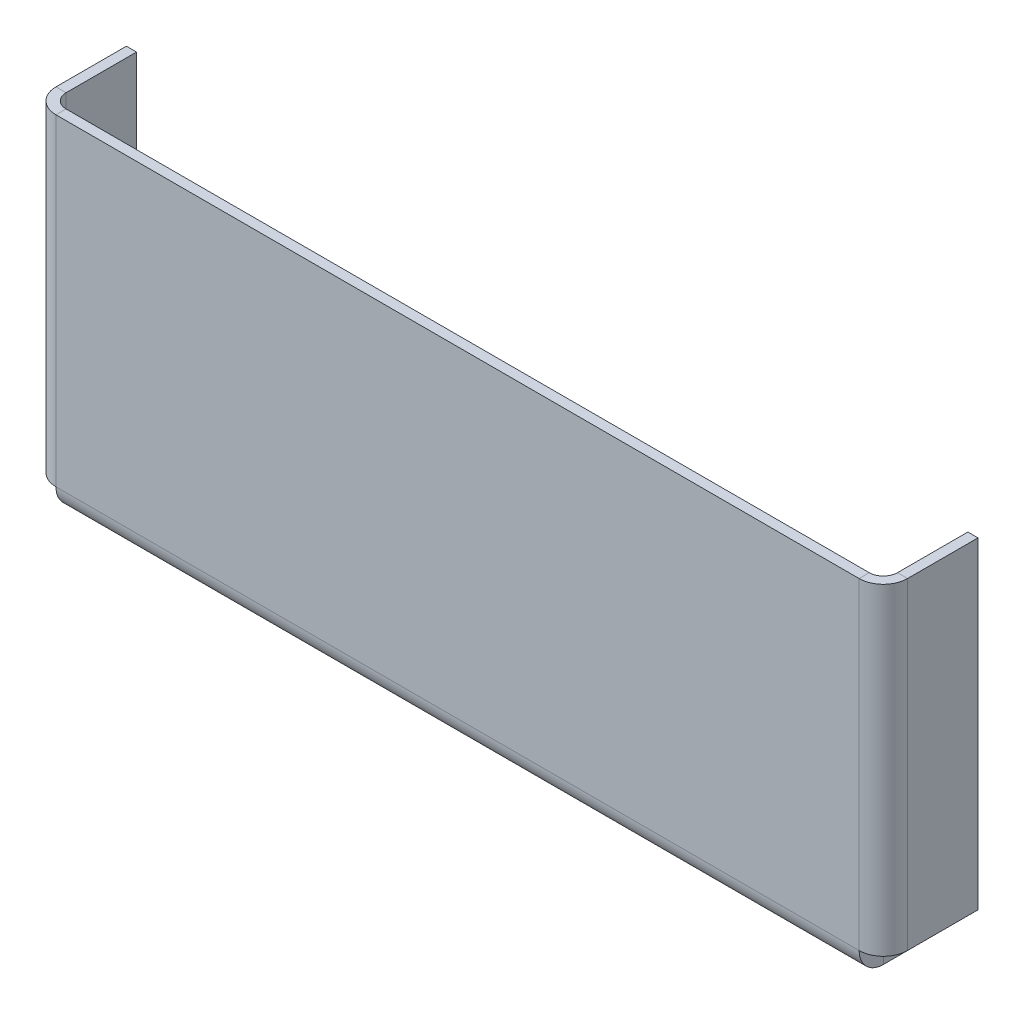
ISO-10303-21;
HEADER;
FILE_DESCRIPTION(('STEP AP214'),'2;1');
FILE_NAME('part.step','',(''),(''),'','','');
FILE_SCHEMA(('AUTOMOTIVE_DESIGN { 1 0 10303 214 1 1 1 1 }'));
ENDSEC;
DATA;
#1=APPLICATION_CONTEXT('core data for automotive mechanical design processes');
#2=APPLICATION_PROTOCOL_DEFINITION('international standard','automotive_design',2000,#1);
#3=PRODUCT_CONTEXT('',#1,'mechanical');
#4=PRODUCT('Part','Part','',(#3));
#5=PRODUCT_RELATED_PRODUCT_CATEGORY('part','',(#4));
#6=PRODUCT_DEFINITION_FORMATION('','',#4);
#7=PRODUCT_DEFINITION_CONTEXT('part definition',#1,'design');
#8=PRODUCT_DEFINITION('design','',#6,#7);
#9=PRODUCT_DEFINITION_SHAPE('','',#8);
#10=(LENGTH_UNIT() NAMED_UNIT(*) SI_UNIT(.MILLI.,.METRE.));
#11=(NAMED_UNIT(*) PLANE_ANGLE_UNIT() SI_UNIT($,.RADIAN.));
#12=(NAMED_UNIT(*) SI_UNIT($,.STERADIAN.) SOLID_ANGLE_UNIT());
#13=UNCERTAINTY_MEASURE_WITH_UNIT(LENGTH_MEASURE(1.E-05),#10,'distance_accuracy_value','');
#14=(GEOMETRIC_REPRESENTATION_CONTEXT(3) GLOBAL_UNCERTAINTY_ASSIGNED_CONTEXT((#13)) GLOBAL_UNIT_ASSIGNED_CONTEXT((#10,
#11,#12)) REPRESENTATION_CONTEXT('',''));
#15=CARTESIAN_POINT('',(0.,0.,0.));
#16=DIRECTION('',(0.,0.,1.));
#17=DIRECTION('',(1.,0.,0.));
#18=AXIS2_PLACEMENT_3D('',#15,#16,#17);
#19=CARTESIAN_POINT('',(0.,30.3089154956949,-29.5681400000001));
#20=DIRECTION('',(0.,0.,1.));
#21=DIRECTION('',(0.,-1.,0.));
#22=AXIS2_PLACEMENT_3D('',#19,#20,#21);
#23=PLANE('',#22);
#24=DIRECTION('',(0.,1.,0.));
#25=VECTOR('',#24,1.);
#26=CARTESIAN_POINT('',(0.,30.3089154956949,-29.5681400000001));
#27=LINE('',#26,#25);
#28=CARTESIAN_POINT('',(0.,1.27000000000001,-29.56814));
#29=VERTEX_POINT('',#28);
#30=CARTESIAN_POINT('',(0.,30.3089154956949,-29.5681400000001));
#31=VERTEX_POINT('',#30);
#32=EDGE_CURVE('E85',#29,#31,#27,.T.);
#33=ORIENTED_EDGE('',*,*,#32,.F.);
#34=DIRECTION('',(1.,0.,0.));
#35=VECTOR('',#34,1.);
#36=CARTESIAN_POINT('',(0.,1.27000000000001,-29.56814));
#37=LINE('',#36,#35);
#38=CARTESIAN_POINT('',(72.39,1.27000000000001,-29.56814));
#39=VERTEX_POINT('',#38);
#40=EDGE_CURVE('E311',#29,#39,#37,.T.);
#41=ORIENTED_EDGE('',*,*,#40,.T.);
#42=DIRECTION('',(0.,-1.,0.));
#43=VECTOR('',#42,1.);
#44=CARTESIAN_POINT('',(72.39,30.3089154956948,-29.5681400000001));
#45=LINE('',#44,#43);
#46=CARTESIAN_POINT('',(72.39,30.3089154956948,-29.5681400000001));
#47=VERTEX_POINT('',#46);
#48=EDGE_CURVE('E99',#47,#39,#45,.T.);
#49=ORIENTED_EDGE('',*,*,#48,.F.);
#50=DIRECTION('',(1.,0.,0.));
#51=VECTOR('',#50,1.);
#52=CARTESIAN_POINT('',(0.,30.3089154956949,-29.5681400000001));
#53=LINE('',#52,#51);
#54=EDGE_CURVE('E183',#31,#47,#53,.T.);
#55=ORIENTED_EDGE('',*,*,#54,.F.);
#56=EDGE_LOOP('',(#33,#41,#49,#55));
#57=FACE_BOUND('',#56,.T.);
#58=ADVANCED_FACE('F81',(#57),#23,.T.);
#59=CARTESIAN_POINT('',(0.,30.3089154956949,-29.5681400000001));
#60=DIRECTION('',(0.,1.,0.));
#61=DIRECTION('',(1.,0.,0.));
#62=AXIS2_PLACEMENT_3D('',#59,#60,#61);
#63=PLANE('',#62);
#64=DIRECTION('',(1.,0.,0.));
#65=VECTOR('',#64,1.);
#66=CARTESIAN_POINT('',(0.,30.3089154956948,-30.4800000000001));
#67=LINE('',#66,#65);
#68=CARTESIAN_POINT('',(0.,30.3089154956948,-30.4800000000001));
#69=VERTEX_POINT('',#68);
#70=CARTESIAN_POINT('',(72.39,30.3089154956948,-30.4800000000001));
#71=VERTEX_POINT('',#70);
#72=EDGE_CURVE('E306',#69,#71,#67,.T.);
#73=ORIENTED_EDGE('',*,*,#72,.F.);
#74=DIRECTION('',(0.,0.,-1.));
#75=VECTOR('',#74,1.);
#76=CARTESIAN_POINT('',(0.,30.3089154956949,-29.5681400000001));
#77=LINE('',#76,#75);
#78=EDGE_CURVE('E219',#31,#69,#77,.T.);
#79=ORIENTED_EDGE('',*,*,#78,.F.);
#80=ORIENTED_EDGE('',*,*,#54,.T.);
#81=DIRECTION('',(0.,0.,-1.));
#82=VECTOR('',#81,1.);
#83=CARTESIAN_POINT('',(72.39,30.3089154956948,-29.5681400000001));
#84=LINE('',#83,#82);
#85=EDGE_CURVE('E309',#47,#71,#84,.T.);
#86=ORIENTED_EDGE('',*,*,#85,.T.);
#87=EDGE_LOOP('',(#73,#79,#80,#86));
#88=FACE_BOUND('',#87,.T.);
#89=ADVANCED_FACE('F454',(#88),#63,.T.);
#90=CARTESIAN_POINT('',(0.,30.3089154956948,-30.4800000000001));
#91=DIRECTION('',(0.,0.,1.));
#92=DIRECTION('',(0.,-1.,0.));
#93=AXIS2_PLACEMENT_3D('',#90,#91,#92);
#94=PLANE('',#93);
#95=DIRECTION('',(1.,0.,0.));
#96=VECTOR('',#95,1.);
#97=CARTESIAN_POINT('',(0.,1.27,-30.48));
#98=LINE('',#97,#96);
#99=CARTESIAN_POINT('',(0.,1.27,-30.48));
#100=VERTEX_POINT('',#99);
#101=CARTESIAN_POINT('',(72.39,1.27,-30.48));
#102=VERTEX_POINT('',#101);
#103=EDGE_CURVE('E91',#100,#102,#98,.T.);
#104=ORIENTED_EDGE('',*,*,#103,.F.);
#105=DIRECTION('',(0.,1.,0.));
#106=VECTOR('',#105,1.);
#107=CARTESIAN_POINT('',(0.,30.3089154956948,-30.4800000000001));
#108=LINE('',#107,#106);
#109=EDGE_CURVE('E112',#100,#69,#108,.T.);
#110=ORIENTED_EDGE('',*,*,#109,.T.);
#111=ORIENTED_EDGE('',*,*,#72,.T.);
#112=DIRECTION('',(0.,-1.,0.));
#113=VECTOR('',#112,1.);
#114=CARTESIAN_POINT('',(72.39,30.3089154956948,-30.4800000000001));
#115=LINE('',#114,#113);
#116=EDGE_CURVE('E308',#71,#102,#115,.T.);
#117=ORIENTED_EDGE('',*,*,#116,.T.);
#118=EDGE_LOOP('',(#104,#110,#111,#117));
#119=FACE_BOUND('',#118,.T.);
#120=ADVANCED_FACE('F83',(#119),#94,.F.);
#121=CARTESIAN_POINT('',(49.53,-0.91186,-50.8));
#122=DIRECTION('',(0.485642931178632,0.,-0.874157276121538));
#123=DIRECTION('',(-0.874157276121538,0.,-0.485642931178632));
#124=AXIS2_PLACEMENT_3D('',#121,#122,#123);
#125=PLANE('',#124);
#126=DIRECTION('',(-0.874157276121538,0.,-0.485642931178632));
#127=VECTOR('',#126,1.);
#128=CARTESIAN_POINT('',(49.53,0.,-50.8));
#129=LINE('',#128,#127);
#130=CARTESIAN_POINT('',(72.39,0.,-38.1));
#131=VERTEX_POINT('',#130);
#132=CARTESIAN_POINT('',(49.53,0.,-50.8));
#133=VERTEX_POINT('',#132);
#134=EDGE_CURVE('E273',#131,#133,#129,.T.);
#135=ORIENTED_EDGE('',*,*,#134,.F.);
#136=DIRECTION('',(0.,1.,0.));
#137=VECTOR('',#136,1.);
#138=CARTESIAN_POINT('',(72.39,-0.91186,-38.1));
#139=LINE('',#138,#137);
#140=CARTESIAN_POINT('',(72.39,-0.91186,-38.1));
#141=VERTEX_POINT('',#140);
#142=EDGE_CURVE('E264',#141,#131,#139,.T.);
#143=ORIENTED_EDGE('',*,*,#142,.F.);
#144=DIRECTION('',(-0.874157276121538,0.,-0.485642931178632));
#145=VECTOR('',#144,1.);
#146=CARTESIAN_POINT('',(49.53,-0.91186,-50.8));
#147=LINE('',#146,#145);
#148=CARTESIAN_POINT('',(49.53,-0.91186,-50.8));
#149=VERTEX_POINT('',#148);
#150=EDGE_CURVE('E294',#141,#149,#147,.T.);
#151=ORIENTED_EDGE('',*,*,#150,.T.);
#152=DIRECTION('',(0.,1.,0.));
#153=VECTOR('',#152,1.);
#154=CARTESIAN_POINT('',(49.53,-0.91186,-50.8));
#155=LINE('',#154,#153);
#156=EDGE_CURVE('E292',#149,#133,#155,.T.);
#157=ORIENTED_EDGE('',*,*,#156,.T.);
#158=EDGE_LOOP('',(#135,#143,#151,#157));
#159=FACE_BOUND('',#158,.T.);
#160=ADVANCED_FACE('F456',(#159),#125,.T.);
#161=CARTESIAN_POINT('',(22.86,-0.91186,-50.8));
#162=DIRECTION('',(0.,0.,-1.));
#163=DIRECTION('',(-1.,0.,0.));
#164=AXIS2_PLACEMENT_3D('',#161,#162,#163);
#165=PLANE('',#164);
#166=DIRECTION('',(-1.,0.,0.));
#167=VECTOR('',#166,1.);
#168=CARTESIAN_POINT('',(22.86,0.,-50.8));
#169=LINE('',#168,#167);
#170=CARTESIAN_POINT('',(22.86,0.,-50.8));
#171=VERTEX_POINT('',#170);
#172=EDGE_CURVE('E270',#133,#171,#169,.T.);
#173=ORIENTED_EDGE('',*,*,#172,.F.);
#174=ORIENTED_EDGE('',*,*,#156,.F.);
#175=DIRECTION('',(-1.,0.,0.));
#176=VECTOR('',#175,1.);
#177=CARTESIAN_POINT('',(22.86,-0.91186,-50.8));
#178=LINE('',#177,#176);
#179=CARTESIAN_POINT('',(22.86,-0.91186,-50.8));
#180=VERTEX_POINT('',#179);
#181=EDGE_CURVE('E289',#149,#180,#178,.T.);
#182=ORIENTED_EDGE('',*,*,#181,.T.);
#183=DIRECTION('',(0.,1.,0.));
#184=VECTOR('',#183,1.);
#185=CARTESIAN_POINT('',(22.86,-0.91186,-50.8));
#186=LINE('',#185,#184);
#187=EDGE_CURVE('E287',#180,#171,#186,.T.);
#188=ORIENTED_EDGE('',*,*,#187,.T.);
#189=EDGE_LOOP('',(#173,#174,#182,#188));
#190=FACE_BOUND('',#189,.T.);
#191=ADVANCED_FACE('F461',(#190),#165,.T.);
#192=CARTESIAN_POINT('',(0.,-0.91186,-38.1));
#193=DIRECTION('',(-0.485642931178633,0.,-0.874157276121537));
#194=DIRECTION('',(-0.874157276121537,0.,0.485642931178633));
#195=AXIS2_PLACEMENT_3D('',#192,#193,#194);
#196=PLANE('',#195);
#197=DIRECTION('',(-0.874157276121537,0.,0.485642931178633));
#198=VECTOR('',#197,1.);
#199=CARTESIAN_POINT('',(0.,0.,-38.1));
#200=LINE('',#199,#198);
#201=CARTESIAN_POINT('',(0.,0.,-38.1));
#202=VERTEX_POINT('',#201);
#203=EDGE_CURVE('E267',#171,#202,#200,.T.);
#204=ORIENTED_EDGE('',*,*,#203,.F.);
#205=ORIENTED_EDGE('',*,*,#187,.F.);
#206=DIRECTION('',(-0.874157276121537,0.,0.485642931178633));
#207=VECTOR('',#206,1.);
#208=CARTESIAN_POINT('',(0.,-0.91186,-38.1));
#209=LINE('',#208,#207);
#210=CARTESIAN_POINT('',(0.,-0.91186,-38.1));
#211=VERTEX_POINT('',#210);
#212=EDGE_CURVE('E284',#180,#211,#209,.T.);
#213=ORIENTED_EDGE('',*,*,#212,.T.);
#214=DIRECTION('',(0.,1.,0.));
#215=VECTOR('',#214,1.);
#216=CARTESIAN_POINT('',(0.,-0.91186,-38.1));
#217=LINE('',#216,#215);
#218=EDGE_CURVE('E282',#211,#202,#217,.T.);
#219=ORIENTED_EDGE('',*,*,#218,.T.);
#220=EDGE_LOOP('',(#204,#205,#213,#219));
#221=FACE_BOUND('',#220,.T.);
#222=ADVANCED_FACE('F483',(#221),#196,.T.);
#223=CARTESIAN_POINT('',(0.,-0.91186,0.));
#224=DIRECTION('',(0.,-1.,0.));
#225=DIRECTION('',(0.,0.,-1.));
#226=AXIS2_PLACEMENT_3D('',#223,#224,#225);
#227=PLANE('',#226);
#228=DIRECTION('',(1.,0.,0.));
#229=VECTOR('',#228,1.);
#230=CARTESIAN_POINT('',(0.,-0.91186,-31.75));
#231=LINE('',#230,#229);
#232=CARTESIAN_POINT('',(0.,-0.91186,-31.75));
#233=VERTEX_POINT('',#232);
#234=CARTESIAN_POINT('',(72.39,-0.91186,-31.75));
#235=VERTEX_POINT('',#234);
#236=EDGE_CURVE('E261',#233,#235,#231,.T.);
#237=ORIENTED_EDGE('',*,*,#236,.F.);
#238=DIRECTION('',(0.,0.,1.));
#239=VECTOR('',#238,1.);
#240=CARTESIAN_POINT('',(0.,-0.91186,0.));
#241=LINE('',#240,#239);
#242=EDGE_CURVE('E163',#211,#233,#241,.T.);
#243=ORIENTED_EDGE('',*,*,#242,.F.);
#244=ORIENTED_EDGE('',*,*,#212,.F.);
#245=ORIENTED_EDGE('',*,*,#181,.F.);
#246=ORIENTED_EDGE('',*,*,#150,.F.);
#247=DIRECTION('',(0.,0.,-1.));
#248=VECTOR('',#247,1.);
#249=CARTESIAN_POINT('',(72.39,-0.91186,0.));
#250=LINE('',#249,#248);
#251=EDGE_CURVE('E121',#235,#141,#250,.T.);
#252=ORIENTED_EDGE('',*,*,#251,.F.);
#253=EDGE_LOOP('',(#237,#243,#244,#245,#246,#252));
#254=FACE_BOUND('',#253,.T.);
#255=ADVANCED_FACE('F480',(#254),#227,.T.);
#256=CARTESIAN_POINT('',(0.,-0.91186,0.));
#257=DIRECTION('',(-1.,0.,0.));
#258=DIRECTION('',(0.,0.,1.));
#259=AXIS2_PLACEMENT_3D('',#256,#257,#258);
#260=PLANE('',#259);
#261=DIRECTION('',(0.,-1.,0.));
#262=VECTOR('',#261,1.);
#263=CARTESIAN_POINT('',(0.,-0.911860000000002,-31.75));
#264=LINE('',#263,#262);
#265=CARTESIAN_POINT('',(0.,0.,-31.75));
#266=VERTEX_POINT('',#265);
#267=EDGE_CURVE('E297',#266,#233,#264,.T.);
#268=ORIENTED_EDGE('',*,*,#267,.F.);
#269=DIRECTION('',(0.,0.,1.));
#270=VECTOR('',#269,1.);
#271=CARTESIAN_POINT('',(0.,0.,0.));
#272=LINE('',#271,#270);
#273=EDGE_CURVE('E279',#202,#266,#272,.T.);
#274=ORIENTED_EDGE('',*,*,#273,.F.);
#275=ORIENTED_EDGE('',*,*,#218,.F.);
#276=ORIENTED_EDGE('',*,*,#242,.T.);
#277=EDGE_LOOP('',(#268,#274,#275,#276));
#278=FACE_BOUND('',#277,.T.);
#279=ADVANCED_FACE('F476',(#278),#260,.T.);
#280=CARTESIAN_POINT('',(0.,0.,0.));
#281=DIRECTION('',(0.,-1.,0.));
#282=DIRECTION('',(0.,0.,-1.));
#283=AXIS2_PLACEMENT_3D('',#280,#281,#282);
#284=PLANE('',#283);
#285=ORIENTED_EDGE('',*,*,#273,.T.);
#286=DIRECTION('',(1.,0.,0.));
#287=VECTOR('',#286,1.);
#288=CARTESIAN_POINT('',(0.,0.,-31.75));
#289=LINE('',#288,#287);
#290=CARTESIAN_POINT('',(72.39,0.,-31.75));
#291=VERTEX_POINT('',#290);
#292=EDGE_CURVE('E277',#266,#291,#289,.T.);
#293=ORIENTED_EDGE('',*,*,#292,.T.);
#294=DIRECTION('',(0.,0.,-1.));
#295=VECTOR('',#294,1.);
#296=CARTESIAN_POINT('',(72.39,0.,0.));
#297=LINE('',#296,#295);
#298=EDGE_CURVE('E151',#291,#131,#297,.T.);
#299=ORIENTED_EDGE('',*,*,#298,.T.);
#300=ORIENTED_EDGE('',*,*,#134,.T.);
#301=ORIENTED_EDGE('',*,*,#172,.T.);
#302=ORIENTED_EDGE('',*,*,#203,.T.);
#303=EDGE_LOOP('',(#285,#293,#299,#300,#301,#302));
#304=FACE_BOUND('',#303,.T.);
#305=ADVANCED_FACE('F473',(#304),#284,.F.);
#306=CARTESIAN_POINT('',(72.39,-0.91186,0.));
#307=DIRECTION('',(1.,0.,0.));
#308=DIRECTION('',(0.,0.,-1.));
#309=AXIS2_PLACEMENT_3D('',#306,#307,#308);
#310=PLANE('',#309);
#311=DIRECTION('',(0.,1.,0.));
#312=VECTOR('',#311,1.);
#313=CARTESIAN_POINT('',(72.39,-0.911860000000002,-31.75));
#314=LINE('',#313,#312);
#315=EDGE_CURVE('E300',#235,#291,#314,.T.);
#316=ORIENTED_EDGE('',*,*,#315,.F.);
#317=ORIENTED_EDGE('',*,*,#251,.T.);
#318=ORIENTED_EDGE('',*,*,#142,.T.);
#319=ORIENTED_EDGE('',*,*,#298,.F.);
#320=EDGE_LOOP('',(#316,#317,#318,#319));
#321=FACE_BOUND('',#320,.T.);
#322=ADVANCED_FACE('F469',(#321),#310,.T.);
#323=CARTESIAN_POINT('',(0.,1.27,-31.75));
#324=DIRECTION('',(-1.,0.,0.));
#325=DIRECTION('',(0.,0.,1.));
#326=AXIS2_PLACEMENT_3D('',#323,#324,#325);
#327=PLANE('',#326);
#328=DIRECTION('',(0.,0.,1.));
#329=VECTOR('',#328,1.);
#330=CARTESIAN_POINT('',(0.,1.27000000000001,-29.56814));
#331=LINE('',#330,#329);
#332=EDGE_CURVE('E173',#100,#29,#331,.T.);
#333=ORIENTED_EDGE('',*,*,#332,.F.);
#334=CARTESIAN_POINT('',(0.,1.27,-31.75));
#335=DIRECTION('',(-1.,0.,0.));
#336=DIRECTION('',(0.,0.,1.));
#337=AXIS2_PLACEMENT_3D('',#334,#335,#336);
#338=CIRCLE('',#337,1.27);
#339=EDGE_CURVE('E250',#100,#266,#338,.F.);
#340=ORIENTED_EDGE('',*,*,#339,.T.);
#341=ORIENTED_EDGE('',*,*,#267,.T.);
#342=CARTESIAN_POINT('',(0.,1.27,-31.75));
#343=DIRECTION('',(1.,0.,0.));
#344=DIRECTION('',(0.,0.,1.));
#345=AXIS2_PLACEMENT_3D('',#342,#343,#344);
#346=CIRCLE('',#345,2.18186);
#347=EDGE_CURVE('E254',#29,#233,#346,.T.);
#348=ORIENTED_EDGE('',*,*,#347,.F.);
#349=EDGE_LOOP('',(#333,#340,#341,#348));
#350=FACE_BOUND('',#349,.T.);
#351=ADVANCED_FACE('F472',(#350),#327,.T.);
#352=CARTESIAN_POINT('',(72.39,1.27,-31.75));
#353=DIRECTION('',(1.,0.,0.));
#354=DIRECTION('',(0.,0.,-1.));
#355=AXIS2_PLACEMENT_3D('',#352,#353,#354);
#356=PLANE('',#355);
#357=CARTESIAN_POINT('',(72.39,1.27,-31.75));
#358=DIRECTION('',(-1.,0.,0.));
#359=DIRECTION('',(0.,0.,1.));
#360=AXIS2_PLACEMENT_3D('',#357,#358,#359);
#361=CIRCLE('',#360,1.27);
#362=EDGE_CURVE('E258',#291,#102,#361,.T.);
#363=ORIENTED_EDGE('',*,*,#362,.T.);
#364=DIRECTION('',(0.,0.,-1.));
#365=VECTOR('',#364,1.);
#366=CARTESIAN_POINT('',(72.39,1.27000000000001,-29.56814));
#367=LINE('',#366,#365);
#368=EDGE_CURVE('E13',#39,#102,#367,.T.);
#369=ORIENTED_EDGE('',*,*,#368,.F.);
#370=CARTESIAN_POINT('',(72.39,1.27,-31.75));
#371=DIRECTION('',(-1.,0.,0.));
#372=DIRECTION('',(0.,0.,-1.));
#373=AXIS2_PLACEMENT_3D('',#370,#371,#372);
#374=CIRCLE('',#373,2.18186);
#375=EDGE_CURVE('E257',#235,#39,#374,.T.);
#376=ORIENTED_EDGE('',*,*,#375,.F.);
#377=ORIENTED_EDGE('',*,*,#315,.T.);
#378=EDGE_LOOP('',(#363,#369,#376,#377));
#379=FACE_BOUND('',#378,.T.);
#380=ADVANCED_FACE('F490',(#379),#356,.T.);
#381=CARTESIAN_POINT('',(108.641487615681,1.27,-31.75));
#382=DIRECTION('',(-1.,0.,0.));
#383=DIRECTION('',(0.,0.,1.));
#384=AXIS2_PLACEMENT_3D('',#381,#382,#383);
#385=CYLINDRICAL_SURFACE('',#384,2.18186);
#386=ORIENTED_EDGE('',*,*,#236,.T.);
#387=ORIENTED_EDGE('',*,*,#375,.T.);
#388=ORIENTED_EDGE('',*,*,#40,.F.);
#389=ORIENTED_EDGE('',*,*,#347,.T.);
#390=EDGE_LOOP('',(#386,#387,#388,#389));
#391=FACE_BOUND('',#390,.T.);
#392=ADVANCED_FACE('F493',(#391),#385,.T.);
#393=CARTESIAN_POINT('',(108.641487615681,1.27,-31.75));
#394=DIRECTION('',(-1.,0.,0.));
#395=DIRECTION('',(0.,0.,1.));
#396=AXIS2_PLACEMENT_3D('',#393,#394,#395);
#397=CYLINDRICAL_SURFACE('',#396,1.27);
#398=ORIENTED_EDGE('',*,*,#292,.F.);
#399=ORIENTED_EDGE('',*,*,#339,.F.);
#400=ORIENTED_EDGE('',*,*,#103,.T.);
#401=ORIENTED_EDGE('',*,*,#362,.F.);
#402=EDGE_LOOP('',(#398,#399,#400,#401));
#403=FACE_BOUND('',#402,.T.);
#404=ADVANCED_FACE('F497',(#403),#397,.F.);
#405=CARTESIAN_POINT('',(0.,1.27,-31.75));
#406=DIRECTION('',(0.,-1.,0.));
#407=DIRECTION('',(0.,0.,-1.));
#408=AXIS2_PLACEMENT_3D('',#405,#406,#407);
#409=PLANE('',#408);
#410=DIRECTION('',(1.,0.,0.));
#411=VECTOR('',#410,1.);
#412=CARTESIAN_POINT('',(-2.18186,1.27,-31.75));
#413=LINE('',#412,#411);
#414=CARTESIAN_POINT('',(-1.27,1.27,-31.75));
#415=VERTEX_POINT('',#414);
#416=CARTESIAN_POINT('',(-2.18186,1.27,-31.75));
#417=VERTEX_POINT('',#416);
#418=EDGE_CURVE('E209',#415,#417,#413,.F.);
#419=ORIENTED_EDGE('',*,*,#418,.F.);
#420=CARTESIAN_POINT('',(0.,1.27,-31.75));
#421=DIRECTION('',(0.,1.,0.));
#422=DIRECTION('',(0.,0.,1.));
#423=AXIS2_PLACEMENT_3D('',#420,#421,#422);
#424=CIRCLE('',#423,1.27);
#425=EDGE_CURVE('E203',#100,#415,#424,.F.);
#426=ORIENTED_EDGE('',*,*,#425,.F.);
#427=ORIENTED_EDGE('',*,*,#332,.T.);
#428=CARTESIAN_POINT('',(0.,1.27,-31.75));
#429=DIRECTION('',(0.,1.,0.));
#430=DIRECTION('',(0.,0.,1.));
#431=AXIS2_PLACEMENT_3D('',#428,#429,#430);
#432=CIRCLE('',#431,2.18186);
#433=EDGE_CURVE('E247',#29,#417,#432,.F.);
#434=ORIENTED_EDGE('',*,*,#433,.T.);
#435=EDGE_LOOP('',(#419,#426,#427,#434));
#436=FACE_BOUND('',#435,.T.);
#437=ADVANCED_FACE('F327',(#436),#409,.T.);
#438=CARTESIAN_POINT('',(0.,30.3089154956948,-31.7500000000001));
#439=DIRECTION('',(0.,-1.,0.));
#440=DIRECTION('',(0.,0.,-1.));
#441=AXIS2_PLACEMENT_3D('',#438,#439,#440);
#442=PLANE('',#441);
#443=CARTESIAN_POINT('',(0.,30.3089154956948,-31.7500000000001));
#444=DIRECTION('',(0.,1.,0.));
#445=DIRECTION('',(0.,0.,1.));
#446=AXIS2_PLACEMENT_3D('',#443,#444,#445);
#447=CIRCLE('',#446,1.27);
#448=CARTESIAN_POINT('',(-1.27,30.3089154956948,-31.75));
#449=VERTEX_POINT('',#448);
#450=EDGE_CURVE('E201',#449,#69,#447,.T.);
#451=ORIENTED_EDGE('',*,*,#450,.F.);
#452=DIRECTION('',(1.,0.,0.));
#453=VECTOR('',#452,1.);
#454=CARTESIAN_POINT('',(-1.27,30.3089154956948,-31.7500000000001));
#455=LINE('',#454,#453);
#456=CARTESIAN_POINT('',(-2.18186,30.3089154956948,-31.7500000000001));
#457=VERTEX_POINT('',#456);
#458=EDGE_CURVE('E208',#449,#457,#455,.F.);
#459=ORIENTED_EDGE('',*,*,#458,.T.);
#460=CARTESIAN_POINT('',(0.,30.3089154956948,-31.7500000000001));
#461=DIRECTION('',(0.,1.,0.));
#462=DIRECTION('',(0.,0.,1.));
#463=AXIS2_PLACEMENT_3D('',#460,#461,#462);
#464=CIRCLE('',#463,2.18186);
#465=EDGE_CURVE('E251',#457,#31,#464,.T.);
#466=ORIENTED_EDGE('',*,*,#465,.T.);
#467=ORIENTED_EDGE('',*,*,#78,.T.);
#468=EDGE_LOOP('',(#451,#459,#466,#467));
#469=FACE_BOUND('',#468,.T.);
#470=ADVANCED_FACE('F215',(#469),#442,.F.);
#471=CARTESIAN_POINT('',(0.,30.3089154956948,-31.7500000000001));
#472=DIRECTION('',(0.,1.,0.));
#473=DIRECTION('',(-1.,0.,0.));
#474=AXIS2_PLACEMENT_3D('',#471,#472,#473);
#475=CYLINDRICAL_SURFACE('',#474,2.18186);
#476=ORIENTED_EDGE('',*,*,#32,.T.);
#477=ORIENTED_EDGE('',*,*,#465,.F.);
#478=DIRECTION('',(0.,1.,0.));
#479=VECTOR('',#478,1.);
#480=CARTESIAN_POINT('',(-2.18186,1.26999999999999,-31.75));
#481=LINE('',#480,#479);
#482=EDGE_CURVE('E232',#457,#417,#481,.F.);
#483=ORIENTED_EDGE('',*,*,#482,.T.);
#484=ORIENTED_EDGE('',*,*,#433,.F.);
#485=EDGE_LOOP('',(#476,#477,#483,#484));
#486=FACE_BOUND('',#485,.T.);
#487=ADVANCED_FACE('F323',(#486),#475,.T.);
#488=CARTESIAN_POINT('',(0.,30.3089154956948,-31.7500000000001));
#489=DIRECTION('',(0.,1.,0.));
#490=DIRECTION('',(-1.,0.,0.));
#491=AXIS2_PLACEMENT_3D('',#488,#489,#490);
#492=CYLINDRICAL_SURFACE('',#491,1.27);
#493=ORIENTED_EDGE('',*,*,#109,.F.);
#494=ORIENTED_EDGE('',*,*,#425,.T.);
#495=DIRECTION('',(0.,1.,0.));
#496=VECTOR('',#495,1.);
#497=CARTESIAN_POINT('',(-1.27,1.26999999999999,-31.75));
#498=LINE('',#497,#496);
#499=EDGE_CURVE('E198',#415,#449,#498,.T.);
#500=ORIENTED_EDGE('',*,*,#499,.T.);
#501=ORIENTED_EDGE('',*,*,#450,.T.);
#502=EDGE_LOOP('',(#493,#494,#500,#501));
#503=FACE_BOUND('',#502,.T.);
#504=ADVANCED_FACE('F200',(#503),#492,.F.);
#505=CARTESIAN_POINT('',(-2.18186000000002,30.3089154956948,-38.1000000000001));
#506=DIRECTION('',(0.,-1.,0.));
#507=DIRECTION('',(0.,0.,-1.));
#508=AXIS2_PLACEMENT_3D('',#505,#506,#507);
#509=PLANE('',#508);
#510=ORIENTED_EDGE('',*,*,#458,.F.);
#511=DIRECTION('',(0.,0.,1.));
#512=VECTOR('',#511,1.);
#513=CARTESIAN_POINT('',(-1.27000000000002,30.3089154956948,-38.1000000000001));
#514=LINE('',#513,#512);
#515=CARTESIAN_POINT('',(-1.27000000000002,30.3089154956948,-38.1000000000001));
#516=VERTEX_POINT('',#515);
#517=EDGE_CURVE('E228',#449,#516,#514,.F.);
#518=ORIENTED_EDGE('',*,*,#517,.T.);
#519=DIRECTION('',(1.,0.,0.));
#520=VECTOR('',#519,1.);
#521=CARTESIAN_POINT('',(-2.18186000000002,30.3089154956948,-38.1000000000001));
#522=LINE('',#521,#520);
#523=CARTESIAN_POINT('',(-2.18186000000002,30.3089154956948,-38.1000000000001));
#524=VERTEX_POINT('',#523);
#525=EDGE_CURVE('E220',#524,#516,#522,.T.);
#526=ORIENTED_EDGE('',*,*,#525,.F.);
#527=DIRECTION('',(0.,0.,-1.));
#528=VECTOR('',#527,1.);
#529=CARTESIAN_POINT('',(-2.18185999999989,30.308915495695,-1.07215391142435E-13));
#530=LINE('',#529,#528);
#531=EDGE_CURVE('E231',#457,#524,#530,.T.);
#532=ORIENTED_EDGE('',*,*,#531,.F.);
#533=EDGE_LOOP('',(#510,#518,#526,#532));
#534=FACE_BOUND('',#533,.T.);
#535=ADVANCED_FACE('F225',(#534),#509,.F.);
#536=CARTESIAN_POINT('',(-2.18186,1.27,-30.48));
#537=DIRECTION('',(0.,1.,0.));
#538=DIRECTION('',(0.,0.,1.));
#539=AXIS2_PLACEMENT_3D('',#536,#537,#538);
#540=PLANE('',#539);
#541=ORIENTED_EDGE('',*,*,#418,.T.);
#542=DIRECTION('',(0.,0.,1.));
#543=VECTOR('',#542,1.);
#544=CARTESIAN_POINT('',(-2.18185999999989,1.2700000000001,0.));
#545=LINE('',#544,#543);
#546=CARTESIAN_POINT('',(-2.18186000000002,1.26999999999998,-38.1));
#547=VERTEX_POINT('',#546);
#548=EDGE_CURVE('E333',#547,#417,#545,.T.);
#549=ORIENTED_EDGE('',*,*,#548,.F.);
#550=DIRECTION('',(1.,0.,0.));
#551=VECTOR('',#550,1.);
#552=CARTESIAN_POINT('',(-2.18186000000002,1.26999999999998,-38.1));
#553=LINE('',#552,#551);
#554=CARTESIAN_POINT('',(-1.27000000000002,1.26999999999998,-38.1));
#555=VERTEX_POINT('',#554);
#556=EDGE_CURVE('E340',#547,#555,#553,.T.);
#557=ORIENTED_EDGE('',*,*,#556,.T.);
#558=DIRECTION('',(0.,0.,-1.));
#559=VECTOR('',#558,1.);
#560=CARTESIAN_POINT('',(-1.27,1.27,-30.48));
#561=LINE('',#560,#559);
#562=EDGE_CURVE('E239',#555,#415,#561,.F.);
#563=ORIENTED_EDGE('',*,*,#562,.T.);
#564=EDGE_LOOP('',(#541,#549,#557,#563));
#565=FACE_BOUND('',#564,.T.);
#566=ADVANCED_FACE('F331',(#565),#540,.F.);
#567=CARTESIAN_POINT('',(-2.18185999999989,0.,0.));
#568=DIRECTION('',(1.,0.,0.));
#569=DIRECTION('',(0.,0.,-1.));
#570=AXIS2_PLACEMENT_3D('',#567,#568,#569);
#571=PLANE('',#570);
#572=ORIENTED_EDGE('',*,*,#482,.F.);
#573=ORIENTED_EDGE('',*,*,#531,.T.);
#574=DIRECTION('',(0.,-1.,0.));
#575=VECTOR('',#574,1.);
#576=CARTESIAN_POINT('',(-2.18186000000002,-1.27456757429279E-13,-38.1));
#577=LINE('',#576,#575);
#578=EDGE_CURVE('E338',#524,#547,#577,.T.);
#579=ORIENTED_EDGE('',*,*,#578,.T.);
#580=ORIENTED_EDGE('',*,*,#548,.T.);
#581=EDGE_LOOP('',(#572,#573,#579,#580));
#582=FACE_BOUND('',#581,.T.);
#583=ADVANCED_FACE('F336',(#582),#571,.F.);
#584=CARTESIAN_POINT('',(-1.26999999999989,0.,0.));
#585=DIRECTION('',(1.,0.,0.));
#586=DIRECTION('',(0.,0.,-1.));
#587=AXIS2_PLACEMENT_3D('',#584,#585,#586);
#588=PLANE('',#587);
#589=ORIENTED_EDGE('',*,*,#517,.F.);
#590=ORIENTED_EDGE('',*,*,#499,.F.);
#591=ORIENTED_EDGE('',*,*,#562,.F.);
#592=DIRECTION('',(0.,1.,0.));
#593=VECTOR('',#592,1.);
#594=CARTESIAN_POINT('',(-1.27000000000002,1.26999999999998,-38.1));
#595=LINE('',#594,#593);
#596=EDGE_CURVE('E237',#516,#555,#595,.F.);
#597=ORIENTED_EDGE('',*,*,#596,.F.);
#598=EDGE_LOOP('',(#589,#590,#591,#597));
#599=FACE_BOUND('',#598,.T.);
#600=ADVANCED_FACE('F235',(#599),#588,.T.);
#601=CARTESIAN_POINT('',(-2.18186000000002,1.26999999999998,-38.1));
#602=DIRECTION('',(0.,0.,1.));
#603=DIRECTION('',(1.,0.,0.));
#604=AXIS2_PLACEMENT_3D('',#601,#602,#603);
#605=PLANE('',#604);
#606=ORIENTED_EDGE('',*,*,#596,.T.);
#607=ORIENTED_EDGE('',*,*,#556,.F.);
#608=ORIENTED_EDGE('',*,*,#578,.F.);
#609=ORIENTED_EDGE('',*,*,#525,.T.);
#610=EDGE_LOOP('',(#606,#607,#608,#609));
#611=FACE_BOUND('',#610,.T.);
#612=ADVANCED_FACE('F350',(#611),#605,.F.);
#613=CARTESIAN_POINT('',(72.39,30.3089154956948,-31.75));
#614=DIRECTION('',(0.,1.,0.));
#615=DIRECTION('',(0.,0.,1.));
#616=AXIS2_PLACEMENT_3D('',#613,#614,#615);
#617=PLANE('',#616);
#618=DIRECTION('',(-1.,0.,0.));
#619=VECTOR('',#618,1.);
#620=CARTESIAN_POINT('',(74.57186,30.3089154956948,-31.7500000000001));
#621=LINE('',#620,#619);
#622=CARTESIAN_POINT('',(73.66,30.3089154956948,-31.75));
#623=VERTEX_POINT('',#622);
#624=CARTESIAN_POINT('',(74.57186,30.3089154956948,-31.75));
#625=VERTEX_POINT('',#624);
#626=EDGE_CURVE('E381',#623,#625,#621,.F.);
#627=ORIENTED_EDGE('',*,*,#626,.F.);
#628=CARTESIAN_POINT('',(72.39,30.3089154956948,-31.75));
#629=DIRECTION('',(0.,-1.,0.));
#630=DIRECTION('',(0.,0.,-1.));
#631=AXIS2_PLACEMENT_3D('',#628,#629,#630);
#632=CIRCLE('',#631,1.26999999999999);
#633=EDGE_CURVE('E375',#71,#623,#632,.F.);
#634=ORIENTED_EDGE('',*,*,#633,.F.);
#635=ORIENTED_EDGE('',*,*,#85,.F.);
#636=CARTESIAN_POINT('',(72.39,30.3089154956948,-31.75));
#637=DIRECTION('',(0.,-1.,0.));
#638=DIRECTION('',(0.,0.,-1.));
#639=AXIS2_PLACEMENT_3D('',#636,#637,#638);
#640=CIRCLE('',#639,2.18185999999999);
#641=EDGE_CURVE('E246',#47,#625,#640,.F.);
#642=ORIENTED_EDGE('',*,*,#641,.T.);
#643=EDGE_LOOP('',(#627,#634,#635,#642));
#644=FACE_BOUND('',#643,.T.);
#645=ADVANCED_FACE('F451',(#644),#617,.T.);
#646=CARTESIAN_POINT('',(72.39,1.27000000000001,-31.75));
#647=DIRECTION('',(0.,1.,0.));
#648=DIRECTION('',(0.,0.,1.));
#649=AXIS2_PLACEMENT_3D('',#646,#647,#648);
#650=PLANE('',#649);
#651=CARTESIAN_POINT('',(72.39,1.27000000000001,-31.75));
#652=DIRECTION('',(0.,-1.,0.));
#653=DIRECTION('',(0.,0.,-1.));
#654=AXIS2_PLACEMENT_3D('',#651,#652,#653);
#655=CIRCLE('',#654,1.26999999999999);
#656=CARTESIAN_POINT('',(73.66,1.27000000000001,-31.75));
#657=VERTEX_POINT('',#656);
#658=EDGE_CURVE('E373',#657,#102,#655,.T.);
#659=ORIENTED_EDGE('',*,*,#658,.F.);
#660=DIRECTION('',(-1.,0.,0.));
#661=VECTOR('',#660,1.);
#662=CARTESIAN_POINT('',(73.66,1.27000000000001,-31.7499999999999));
#663=LINE('',#662,#661);
#664=CARTESIAN_POINT('',(74.57186,1.27000000000001,-31.7499999999999));
#665=VERTEX_POINT('',#664);
#666=EDGE_CURVE('E380',#657,#665,#663,.F.);
#667=ORIENTED_EDGE('',*,*,#666,.T.);
#668=CARTESIAN_POINT('',(72.39,1.27000000000001,-31.75));
#669=DIRECTION('',(0.,-1.,0.));
#670=DIRECTION('',(0.,0.,-1.));
#671=AXIS2_PLACEMENT_3D('',#668,#669,#670);
#672=CIRCLE('',#671,2.18185999999999);
#673=EDGE_CURVE('E418',#665,#39,#672,.T.);
#674=ORIENTED_EDGE('',*,*,#673,.T.);
#675=ORIENTED_EDGE('',*,*,#368,.T.);
#676=EDGE_LOOP('',(#659,#667,#674,#675));
#677=FACE_BOUND('',#676,.T.);
#678=ADVANCED_FACE('F386',(#677),#650,.F.);
#679=CARTESIAN_POINT('',(72.39,1.27,-31.75));
#680=DIRECTION('',(0.,-1.,0.));
#681=DIRECTION('',(1.,0.,0.));
#682=AXIS2_PLACEMENT_3D('',#679,#680,#681);
#683=CYLINDRICAL_SURFACE('',#682,2.18185999999999);
#684=ORIENTED_EDGE('',*,*,#48,.T.);
#685=ORIENTED_EDGE('',*,*,#673,.F.);
#686=DIRECTION('',(0.,-1.,0.));
#687=VECTOR('',#686,1.);
#688=CARTESIAN_POINT('',(74.57186,30.3089154956948,-31.7500000000001));
#689=LINE('',#688,#687);
#690=EDGE_CURVE('E402',#665,#625,#689,.F.);
#691=ORIENTED_EDGE('',*,*,#690,.T.);
#692=ORIENTED_EDGE('',*,*,#641,.F.);
#693=EDGE_LOOP('',(#684,#685,#691,#692));
#694=FACE_BOUND('',#693,.T.);
#695=ADVANCED_FACE('F422',(#694),#683,.T.);
#696=CARTESIAN_POINT('',(72.39,1.27,-31.75));
#697=DIRECTION('',(0.,-1.,0.));
#698=DIRECTION('',(1.,0.,0.));
#699=AXIS2_PLACEMENT_3D('',#696,#697,#698);
#700=CYLINDRICAL_SURFACE('',#699,1.26999999999999);
#701=ORIENTED_EDGE('',*,*,#116,.F.);
#702=ORIENTED_EDGE('',*,*,#633,.T.);
#703=DIRECTION('',(0.,-1.,0.));
#704=VECTOR('',#703,1.);
#705=CARTESIAN_POINT('',(73.66,30.3089154956948,-31.7500000000001));
#706=LINE('',#705,#704);
#707=EDGE_CURVE('E370',#623,#657,#706,.T.);
#708=ORIENTED_EDGE('',*,*,#707,.T.);
#709=ORIENTED_EDGE('',*,*,#658,.T.);
#710=EDGE_LOOP('',(#701,#702,#708,#709));
#711=FACE_BOUND('',#710,.T.);
#712=ADVANCED_FACE('F372',(#711),#700,.F.);
#713=CARTESIAN_POINT('',(74.57186,1.27000000000003,-38.1));
#714=DIRECTION('',(0.,1.,0.));
#715=DIRECTION('',(0.,0.,1.));
#716=AXIS2_PLACEMENT_3D('',#713,#714,#715);
#717=PLANE('',#716);
#718=ORIENTED_EDGE('',*,*,#666,.F.);
#719=DIRECTION('',(0.,0.,1.));
#720=VECTOR('',#719,1.);
#721=CARTESIAN_POINT('',(73.66,1.27000000000003,-38.1));
#722=LINE('',#721,#720);
#723=CARTESIAN_POINT('',(73.66,1.27000000000003,-38.1));
#724=VERTEX_POINT('',#723);
#725=EDGE_CURVE('E398',#657,#724,#722,.F.);
#726=ORIENTED_EDGE('',*,*,#725,.T.);
#727=DIRECTION('',(-1.,0.,0.));
#728=VECTOR('',#727,1.);
#729=CARTESIAN_POINT('',(74.57186,1.27000000000002,-38.1));
#730=LINE('',#729,#728);
#731=CARTESIAN_POINT('',(74.57186,1.27000000000003,-38.1));
#732=VERTEX_POINT('',#731);
#733=EDGE_CURVE('E390',#732,#724,#730,.T.);
#734=ORIENTED_EDGE('',*,*,#733,.F.);
#735=DIRECTION('',(0.,0.,-1.));
#736=VECTOR('',#735,1.);
#737=CARTESIAN_POINT('',(74.5718599999998,1.26999999999991,2.70656418125809E-13));
#738=LINE('',#737,#736);
#739=EDGE_CURVE('E401',#665,#732,#738,.T.);
#740=ORIENTED_EDGE('',*,*,#739,.F.);
#741=EDGE_LOOP('',(#718,#726,#734,#740));
#742=FACE_BOUND('',#741,.T.);
#743=ADVANCED_FACE('F395',(#742),#717,.F.);
#744=CARTESIAN_POINT('',(74.57186,30.3089154956948,-30.4800000000001));
#745=DIRECTION('',(0.,-1.,0.));
#746=DIRECTION('',(0.,0.,-1.));
#747=AXIS2_PLACEMENT_3D('',#744,#745,#746);
#748=PLANE('',#747);
#749=ORIENTED_EDGE('',*,*,#626,.T.);
#750=DIRECTION('',(0.,0.,1.));
#751=VECTOR('',#750,1.);
#752=CARTESIAN_POINT('',(74.5718599999999,30.3089154956951,0.));
#753=LINE('',#752,#751);
#754=CARTESIAN_POINT('',(74.57186,30.3089154956948,-38.1000000000001));
#755=VERTEX_POINT('',#754);
#756=EDGE_CURVE('E438',#755,#625,#753,.T.);
#757=ORIENTED_EDGE('',*,*,#756,.F.);
#758=DIRECTION('',(-1.,0.,0.));
#759=VECTOR('',#758,1.);
#760=CARTESIAN_POINT('',(74.57186,30.3089154956948,-38.1000000000001));
#761=LINE('',#760,#759);
#762=CARTESIAN_POINT('',(73.66,30.3089154956948,-38.1000000000001));
#763=VERTEX_POINT('',#762);
#764=EDGE_CURVE('E442',#755,#763,#761,.T.);
#765=ORIENTED_EDGE('',*,*,#764,.T.);
#766=DIRECTION('',(0.,0.,-1.));
#767=VECTOR('',#766,1.);
#768=CARTESIAN_POINT('',(73.66,30.3089154956948,-30.4800000000001));
#769=LINE('',#768,#767);
#770=EDGE_CURVE('E409',#763,#623,#769,.F.);
#771=ORIENTED_EDGE('',*,*,#770,.T.);
#772=EDGE_LOOP('',(#749,#757,#765,#771));
#773=FACE_BOUND('',#772,.T.);
#774=ADVANCED_FACE('F446',(#773),#748,.F.);
#775=CARTESIAN_POINT('',(74.5718599999998,0.,2.6686171052211E-13));
#776=DIRECTION('',(-1.,0.,0.));
#777=DIRECTION('',(0.,0.,1.));
#778=AXIS2_PLACEMENT_3D('',#775,#776,#777);
#779=PLANE('',#778);
#780=ORIENTED_EDGE('',*,*,#690,.F.);
#781=ORIENTED_EDGE('',*,*,#739,.T.);
#782=DIRECTION('',(0.,1.,0.));
#783=VECTOR('',#782,1.);
#784=CARTESIAN_POINT('',(74.57186,-1.63094880680386E-13,-38.1));
#785=LINE('',#784,#783);
#786=EDGE_CURVE('E434',#732,#755,#785,.T.);
#787=ORIENTED_EDGE('',*,*,#786,.T.);
#788=ORIENTED_EDGE('',*,*,#756,.T.);
#789=EDGE_LOOP('',(#780,#781,#787,#788));
#790=FACE_BOUND('',#789,.T.);
#791=ADVANCED_FACE('F436',(#790),#779,.F.);
#792=CARTESIAN_POINT('',(73.6599999999999,0.,2.63677968348473E-13));
#793=DIRECTION('',(-1.,0.,0.));
#794=DIRECTION('',(0.,0.,1.));
#795=AXIS2_PLACEMENT_3D('',#792,#793,#794);
#796=PLANE('',#795);
#797=ORIENTED_EDGE('',*,*,#725,.F.);
#798=ORIENTED_EDGE('',*,*,#707,.F.);
#799=ORIENTED_EDGE('',*,*,#770,.F.);
#800=DIRECTION('',(0.,-1.,0.));
#801=VECTOR('',#800,1.);
#802=CARTESIAN_POINT('',(73.66,30.3089154956948,-38.1000000000001));
#803=LINE('',#802,#801);
#804=EDGE_CURVE('E407',#724,#763,#803,.F.);
#805=ORIENTED_EDGE('',*,*,#804,.F.);
#806=EDGE_LOOP('',(#797,#798,#799,#805));
#807=FACE_BOUND('',#806,.T.);
#808=ADVANCED_FACE('F405',(#807),#796,.T.);
#809=CARTESIAN_POINT('',(74.57186,30.3089154956948,-38.1000000000001));
#810=DIRECTION('',(0.,0.,1.));
#811=DIRECTION('',(1.,0.,0.));
#812=AXIS2_PLACEMENT_3D('',#809,#810,#811);
#813=PLANE('',#812);
#814=ORIENTED_EDGE('',*,*,#804,.T.);
#815=ORIENTED_EDGE('',*,*,#764,.F.);
#816=ORIENTED_EDGE('',*,*,#786,.F.);
#817=ORIENTED_EDGE('',*,*,#733,.T.);
#818=EDGE_LOOP('',(#814,#815,#816,#817));
#819=FACE_BOUND('',#818,.T.);
#820=ADVANCED_FACE('F443',(#819),#813,.F.);
#821=CLOSED_SHELL('',(#58,#89,#120,#160,#191,#222,#255,#279,#305,#322,#351,#380,#392,#404,#437,
#470,#487,#504,#535,#566,#583,#600,#612,#645,#678,#695,#712,#743,#774,#791,#808,#820));
#822=MANIFOLD_SOLID_BREP('B2',#821);
#823=ADVANCED_BREP_SHAPE_REPRESENTATION('',(#18,#822),#14);
#824=SHAPE_DEFINITION_REPRESENTATION(#9,#823);
ENDSEC;
END-ISO-10303-21;
